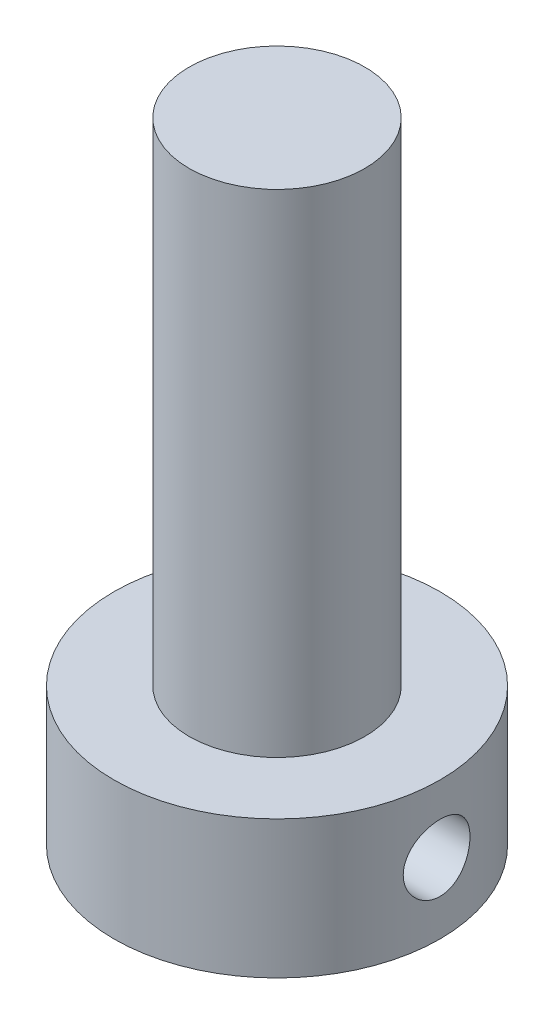
ISO-10303-21;
HEADER;
FILE_DESCRIPTION(('STEP AP214'),'2;1');
FILE_NAME('part.step','',(''),(''),'','','');
FILE_SCHEMA(('AUTOMOTIVE_DESIGN { 1 0 10303 214 1 1 1 1 }'));
ENDSEC;
DATA;
#1=APPLICATION_CONTEXT('core data for automotive mechanical design processes');
#2=APPLICATION_PROTOCOL_DEFINITION('international standard','automotive_design',2000,#1);
#3=PRODUCT_CONTEXT('',#1,'mechanical');
#4=PRODUCT('Part','Part','',(#3));
#5=PRODUCT_RELATED_PRODUCT_CATEGORY('part','',(#4));
#6=PRODUCT_DEFINITION_FORMATION('','',#4);
#7=PRODUCT_DEFINITION_CONTEXT('part definition',#1,'design');
#8=PRODUCT_DEFINITION('design','',#6,#7);
#9=PRODUCT_DEFINITION_SHAPE('','',#8);
#10=(LENGTH_UNIT() NAMED_UNIT(*) SI_UNIT(.MILLI.,.METRE.));
#11=(NAMED_UNIT(*) PLANE_ANGLE_UNIT() SI_UNIT($,.RADIAN.));
#12=(NAMED_UNIT(*) SI_UNIT($,.STERADIAN.) SOLID_ANGLE_UNIT());
#13=UNCERTAINTY_MEASURE_WITH_UNIT(LENGTH_MEASURE(1.E-05),#10,'distance_accuracy_value','');
#14=(GEOMETRIC_REPRESENTATION_CONTEXT(3) GLOBAL_UNCERTAINTY_ASSIGNED_CONTEXT((#13)) GLOBAL_UNIT_ASSIGNED_CONTEXT((#10,
#11,#12)) REPRESENTATION_CONTEXT('',''));
#15=CARTESIAN_POINT('',(0.,0.,0.));
#16=DIRECTION('',(0.,0.,1.));
#17=DIRECTION('',(1.,0.,0.));
#18=AXIS2_PLACEMENT_3D('',#15,#16,#17);
#19=CARTESIAN_POINT('',(-0.0190063993919303,11.1241345920575,3.4804047549231E-07));
#20=DIRECTION('',(0.,-1.,0.));
#21=DIRECTION('',(0.,0.,-1.));
#22=AXIS2_PLACEMENT_3D('',#19,#20,#21);
#23=CYLINDRICAL_SURFACE('',#22,9.28);
#24=CARTESIAN_POINT('',(9.06440705591219,7.28413459205753,-1.89999965195952));
#25=CARTESIAN_POINT('',(9.06440916853078,7.17861786051519,-1.89999581367066));
#26=CARTESIAN_POINT('',(9.06626564456198,7.07305334129833,-1.89117996120403));
#27=CARTESIAN_POINT('',(9.07347938709134,6.86491450004383,-1.85618111325256));
#28=CARTESIAN_POINT('',(9.07883938828324,6.76234257928177,-1.82998455092897));
#29=CARTESIAN_POINT('',(9.09242826101064,6.56323016806453,-1.76107386988814));
#30=CARTESIAN_POINT('',(9.10065420634132,6.46668364362774,-1.71837659399769));
#31=CARTESIAN_POINT('',(9.11904462161573,6.28212577388145,-1.61772315166768));
#32=CARTESIAN_POINT('',(9.12920900023378,6.19411402676634,-1.55976770403961));
#33=CARTESIAN_POINT('',(9.15049923850015,6.02781641616568,-1.42932785744025));
#34=CARTESIAN_POINT('',(9.1616360834077,5.94967539744132,-1.35666055899117));
#35=CARTESIAN_POINT('',(9.18351985479712,5.80660288882074,-1.1992548606362));
#36=CARTESIAN_POINT('',(9.19426675319208,5.74167234889803,-1.1145155933722));
#37=CARTESIAN_POINT('',(9.2142785157898,5.6262991910593,-0.934409257699786));
#38=CARTESIAN_POINT('',(9.22352891349261,5.57599463101883,-0.838952006350561));
#39=CARTESIAN_POINT('',(9.23938183469861,5.49219282741294,-0.640718853735789));
#40=CARTESIAN_POINT('',(9.24598461805236,5.45869393437142,-0.537943671856225));
#41=CARTESIAN_POINT('',(9.25572074235731,5.4099064247618,-0.329496002363501));
#42=CARTESIAN_POINT('',(9.25890066782565,5.39437307707398,-0.223883006676561));
#43=CARTESIAN_POINT('',(9.26159380005305,5.38119364492617,-0.0115054098418896));
#44=CARTESIAN_POINT('',(9.26110737637215,5.38354575765081,0.0952590741550443));
#45=CARTESIAN_POINT('',(9.25655859303601,5.40588567930071,0.305225990689205));
#46=CARTESIAN_POINT('',(9.25254969621842,5.42560983219306,0.408457802743554));
#47=CARTESIAN_POINT('',(9.24146684902902,5.48171526517045,0.610114635440106));
#48=CARTESIAN_POINT('',(9.2343927719238,5.5180972339956,0.708539457144506));
#49=CARTESIAN_POINT('',(9.21788681764972,5.606727079379,0.898535570225475));
#50=CARTESIAN_POINT('',(9.20843978452724,5.65907742450077,0.990057691290772));
#51=CARTESIAN_POINT('',(9.18822799885725,5.77808202634456,1.16311551039762));
#52=CARTESIAN_POINT('',(9.17746308785162,5.84473800386452,1.24465000519121));
#53=CARTESIAN_POINT('',(9.15557137835101,5.99190549155147,1.39698365527803));
#54=CARTESIAN_POINT('',(9.14444156104971,6.07264775715224,1.46755962341433));
#55=CARTESIAN_POINT('',(9.12326030900501,6.24493496935332,1.59420697971006));
#56=CARTESIAN_POINT('',(9.11320889666579,6.3364801403042,1.65027806656048));
#57=CARTESIAN_POINT('',(9.09531604961269,6.52810489868972,1.74640636315005));
#58=CARTESIAN_POINT('',(9.08747981713544,6.62820386865118,1.78642596754076));
#59=CARTESIAN_POINT('',(9.07497976225529,6.83390313726099,1.84901214878485));
#60=CARTESIAN_POINT('',(9.07031550469821,6.93950267916077,1.87158111969907));
#61=CARTESIAN_POINT('',(9.06477507728582,7.15117861843283,1.89828873816));
#62=CARTESIAN_POINT('',(9.06383253672975,7.25721257624674,1.90275034140609));
#63=CARTESIAN_POINT('',(9.06566388978704,7.46850950231294,1.89398692522799));
#64=CARTESIAN_POINT('',(9.06843756186326,7.57377251614793,1.8807629601059));
#65=CARTESIAN_POINT('',(9.07732653506708,7.7794444799331,1.83728265593363));
#66=CARTESIAN_POINT('',(9.08340770804975,7.87989179403268,1.80720017526082));
#67=CARTESIAN_POINT('',(9.09819635148106,8.0743205533884,1.73104324122554));
#68=CARTESIAN_POINT('',(9.10690404705097,8.16830144355407,1.68496741701027));
#69=CARTESIAN_POINT('',(9.12611289928062,8.34853894155987,1.57740546767162));
#70=CARTESIAN_POINT('',(9.13663686448687,8.43467293114395,1.51571802951144));
#71=CARTESIAN_POINT('',(9.15823049456355,8.59548473141401,1.37895106211979));
#72=CARTESIAN_POINT('',(9.16930021833265,8.67016130201503,1.30387008514823));
#73=CARTESIAN_POINT('',(9.19095432576233,8.80717005952009,1.14099463316994));
#74=CARTESIAN_POINT('',(9.20152798543385,8.86928343332557,1.05301443612552));
#75=CARTESIAN_POINT('',(9.22080954488362,8.97784748454099,0.867680335308751));
#76=CARTESIAN_POINT('',(9.22951752536384,9.02429883947836,0.770326837252795));
#77=CARTESIAN_POINT('',(9.2440409183177,9.09990479593734,0.569573333392183));
#78=CARTESIAN_POINT('',(9.249873208945,9.12916052250786,0.46621268799012));
#79=CARTESIAN_POINT('',(9.25806062050926,9.16986412597388,0.255912419751762));
#80=CARTESIAN_POINT('',(9.26041618134028,9.18131425573652,0.148973251440202));
#81=CARTESIAN_POINT('',(9.26137367096313,9.18599092698144,-0.0633616207282361));
#82=CARTESIAN_POINT('',(9.26004324413348,9.17954587192554,-0.168749923503577));
#83=CARTESIAN_POINT('',(9.2539211316132,9.14934255427471,-0.37690762150522));
#84=CARTESIAN_POINT('',(9.24912949380265,9.12558453117571,-0.479677052938869));
#85=CARTESIAN_POINT('',(9.23662602849739,9.06157852483825,-0.679462968312106));
#86=CARTESIAN_POINT('',(9.22892150412584,9.0213717609876,-0.776493143723846));
#87=CARTESIAN_POINT('',(9.2114201322895,8.92565202035419,-0.962476364696922));
#88=CARTESIAN_POINT('',(9.20162310991546,8.87013776392469,-1.05142873415837));
#89=CARTESIAN_POINT('',(9.18080440233948,8.74428013516532,-1.22034985011706));
#90=CARTESIAN_POINT('',(9.16976487170535,8.67370277770617,-1.30014208137443));
#91=CARTESIAN_POINT('',(9.14780886897829,8.52020103477048,-1.44686337449589));
#92=CARTESIAN_POINT('',(9.13689242675937,8.43727371846492,-1.51378937435149));
#93=CARTESIAN_POINT('',(9.11628124295992,8.26029187616301,-1.63360540751771));
#94=CARTESIAN_POINT('',(9.10660183559429,8.16612135179292,-1.68632685875249));
#95=CARTESIAN_POINT('',(9.08974921734628,7.97008441844661,-1.77511360333427));
#96=CARTESIAN_POINT('',(9.08257377136306,7.86822497211477,-1.81119376043668));
#97=CARTESIAN_POINT('',(9.0729481617664,7.68582640352176,-1.85881230562474));
#98=CARTESIAN_POINT('',(9.06976543666068,7.60631578945451,-1.874229447689));
#99=CARTESIAN_POINT('',(9.06549411320475,7.44592431225688,-1.89482439960845));
#100=CARTESIAN_POINT('',(9.06440543598271,7.36504350085043,-1.90000259511137));
#101=CARTESIAN_POINT('',(9.06440705591219,7.28413459205753,-1.89999965195952));
#102=B_SPLINE_CURVE_WITH_KNOTS('',3,(#24,#25,#26,#27,#28,#29,#30,#31,#32,#33,#34,#35,#36,#37,
#38,#39,#40,#41,#42,#43,#44,#45,#46,#47,#48,#49,#50,#51,#52,#53,#54,#55,#56,#57,#58,#59,#60,#61,
#62,#63,#64,#65,#66,#67,#68,#69,#70,#71,#72,#73,#74,#75,#76,#77,#78,#79,#80,#81,#82,#83,#84,#85,
#86,#87,#88,#89,#90,#91,#92,#93,#94,#95,#96,#97,#98,#99,#100,#101),.UNSPECIFIED.,.T.,.F.,(4,2,2,
2,2,2,2,2,2,2,2,2,2,2,2,2,2,2,2,2,2,2,2,2,2,2,2,2,2,2,2,2,2,2,2,2,2,2,4),(0.,0.316253882733866,
0.63275491424508,0.948933732306805,1.26509765786931,1.58546452279707,1.9058544173632,
2.22917704936296,2.55246794103703,2.87130099367439,3.19010190906195,3.50414617344535,
3.81820342358976,4.13431994757148,4.45047451795623,4.77240147151124,5.09433511189809,
5.41701863237331,5.73965787588186,6.0565166729004,6.37335658163672,6.68698757189824,
7.00064545135511,7.31857473084173,7.63653839692168,7.9596366153666,8.2827208550262,
8.60388556323933,8.92500963252803,9.24027974164392,9.55554548960858,9.87002599645942,
10.1845328006298,10.5043360416267,10.8242152979885,11.1477385950966,11.4709723637542,
11.7134810160934,11.9559805342219),.UNSPECIFIED.);
#103=CARTESIAN_POINT('',(9.06440705591219,7.28413459205753,-1.89999965195952));
#104=VERTEX_POINT('',#103);
#105=EDGE_CURVE('E11',#104,#104,#102,.T.);
#106=ORIENTED_EDGE('',*,*,#105,.T.);
#107=EDGE_LOOP('',(#106));
#108=FACE_BOUND('',#107,.T.);
#109=CARTESIAN_POINT('',(-0.0190063993919303,11.1241345920575,3.4804047549231E-07));
#110=DIRECTION('',(0.,1.,0.));
#111=DIRECTION('',(0.,0.,1.));
#112=AXIS2_PLACEMENT_3D('',#109,#110,#111);
#113=CIRCLE('',#112,9.28);
#114=CARTESIAN_POINT('',(-0.0190063993919303,11.1241345920575,9.28000034804048));
#115=VERTEX_POINT('',#114);
#116=EDGE_CURVE('E61',#115,#115,#113,.T.);
#117=ORIENTED_EDGE('',*,*,#116,.F.);
#118=EDGE_LOOP('',(#117));
#119=FACE_BOUND('',#118,.T.);
#120=CARTESIAN_POINT('',(-0.0190063993919303,3.28413459205753,3.4804047549231E-07));
#121=DIRECTION('',(0.,1.,0.));
#122=DIRECTION('',(0.,0.,1.));
#123=AXIS2_PLACEMENT_3D('',#120,#121,#122);
#124=CIRCLE('',#123,9.28);
#125=CARTESIAN_POINT('',(-0.0190063993919303,3.28413459205753,9.28000034804048));
#126=VERTEX_POINT('',#125);
#127=EDGE_CURVE('E67',#126,#126,#124,.T.);
#128=ORIENTED_EDGE('',*,*,#127,.T.);
#129=EDGE_LOOP('',(#128));
#130=FACE_BOUND('',#129,.T.);
#131=ADVANCED_FACE('F44',(#108,#119,#130),#23,.T.);
#132=CARTESIAN_POINT('',(-0.0190063993919303,11.1241345920575,3.4804047549231E-07));
#133=DIRECTION('',(0.,1.,0.));
#134=DIRECTION('',(0.,0.,1.));
#135=AXIS2_PLACEMENT_3D('',#132,#133,#134);
#136=PLANE('',#135);
#137=CARTESIAN_POINT('',(-0.0190063993919303,11.1241345920575,3.4804047549231E-07));
#138=DIRECTION('',(0.,1.,0.));
#139=DIRECTION('',(0.,0.,1.));
#140=AXIS2_PLACEMENT_3D('',#137,#138,#139);
#141=CIRCLE('',#140,5.);
#142=CARTESIAN_POINT('',(-0.0190063993919303,11.1241345920575,5.00000034804048));
#143=VERTEX_POINT('',#142);
#144=EDGE_CURVE('E56',#143,#143,#141,.T.);
#145=ORIENTED_EDGE('',*,*,#144,.F.);
#146=EDGE_LOOP('',(#145));
#147=FACE_BOUND('',#146,.T.);
#148=ORIENTED_EDGE('',*,*,#116,.T.);
#149=EDGE_LOOP('',(#148));
#150=FACE_BOUND('',#149,.T.);
#151=ADVANCED_FACE('F100',(#147,#150),#136,.T.);
#152=CARTESIAN_POINT('',(-0.0190063993919303,3.28413459205753,3.4804047549231E-07));
#153=DIRECTION('',(0.,1.,0.));
#154=DIRECTION('',(0.,0.,1.));
#155=AXIS2_PLACEMENT_3D('',#152,#153,#154);
#156=PLANE('',#155);
#157=ORIENTED_EDGE('',*,*,#127,.F.);
#158=EDGE_LOOP('',(#157));
#159=FACE_BOUND('',#158,.T.);
#160=ADVANCED_FACE('F104',(#159),#156,.F.);
#161=CARTESIAN_POINT('',(-0.0190063993919303,39.1241345920575,3.4804047549231E-07));
#162=DIRECTION('',(0.,-1.,0.));
#163=DIRECTION('',(0.,0.,-1.));
#164=AXIS2_PLACEMENT_3D('',#161,#162,#163);
#165=CYLINDRICAL_SURFACE('',#164,5.);
#166=CARTESIAN_POINT('',(-0.0190063993919303,39.1241345920575,3.4804047549231E-07));
#167=DIRECTION('',(0.,1.,0.));
#168=DIRECTION('',(0.,0.,1.));
#169=AXIS2_PLACEMENT_3D('',#166,#167,#168);
#170=CIRCLE('',#169,5.);
#171=CARTESIAN_POINT('',(-0.0190063993919303,39.1241345920575,5.00000034804048));
#172=VERTEX_POINT('',#171);
#173=EDGE_CURVE('E70',#172,#172,#170,.T.);
#174=ORIENTED_EDGE('',*,*,#173,.F.);
#175=EDGE_LOOP('',(#174));
#176=FACE_BOUND('',#175,.T.);
#177=ORIENTED_EDGE('',*,*,#144,.T.);
#178=EDGE_LOOP('',(#177));
#179=FACE_BOUND('',#178,.T.);
#180=ADVANCED_FACE('F96',(#176,#179),#165,.T.);
#181=CARTESIAN_POINT('',(-0.0190063993919303,39.1241345920575,3.4804047549231E-07));
#182=DIRECTION('',(0.,1.,0.));
#183=DIRECTION('',(0.,0.,1.));
#184=AXIS2_PLACEMENT_3D('',#181,#182,#183);
#185=PLANE('',#184);
#186=ORIENTED_EDGE('',*,*,#173,.T.);
#187=EDGE_LOOP('',(#186));
#188=FACE_BOUND('',#187,.T.);
#189=ADVANCED_FACE('F90',(#188),#185,.T.);
#190=CARTESIAN_POINT('',(5.26099360060807,7.28413459205753,3.4804047549231E-07));
#191=DIRECTION('',(1.,0.,0.));
#192=DIRECTION('',(0.,0.,-1.));
#193=AXIS2_PLACEMENT_3D('',#190,#191,#192);
#194=CYLINDRICAL_SURFACE('',#193,1.9);
#195=CARTESIAN_POINT('',(5.26099360060807,7.28413459205753,3.4804047549231E-07));
#196=DIRECTION('',(1.,0.,0.));
#197=DIRECTION('',(0.,0.,-1.));
#198=AXIS2_PLACEMENT_3D('',#195,#196,#197);
#199=CIRCLE('',#198,1.9);
#200=CARTESIAN_POINT('',(5.26099360060807,7.28413459205753,-1.89999965195952));
#201=VERTEX_POINT('',#200);
#202=EDGE_CURVE('E78',#201,#201,#199,.T.);
#203=ORIENTED_EDGE('',*,*,#202,.F.);
#204=EDGE_LOOP('',(#203));
#205=FACE_BOUND('',#204,.T.);
#206=ORIENTED_EDGE('',*,*,#105,.F.);
#207=EDGE_LOOP('',(#206));
#208=FACE_BOUND('',#207,.T.);
#209=ADVANCED_FACE('F87',(#205,#208),#194,.F.);
#210=CARTESIAN_POINT('',(5.26099360060807,7.28413459205753,3.4804047549231E-07));
#211=DIRECTION('',(1.,0.,0.));
#212=DIRECTION('',(0.,0.,-1.));
#213=AXIS2_PLACEMENT_3D('',#210,#211,#212);
#214=PLANE('',#213);
#215=ORIENTED_EDGE('',*,*,#202,.T.);
#216=EDGE_LOOP('',(#215));
#217=FACE_BOUND('',#216,.T.);
#218=ADVANCED_FACE('F85',(#217),#214,.T.);
#219=CLOSED_SHELL('',(#131,#151,#160,#180,#189,#209,#218));
#220=MANIFOLD_SOLID_BREP('B2',#219);
#221=ADVANCED_BREP_SHAPE_REPRESENTATION('',(#18,#220),#14);
#222=SHAPE_DEFINITION_REPRESENTATION(#9,#221);
ENDSEC;
END-ISO-10303-21;
